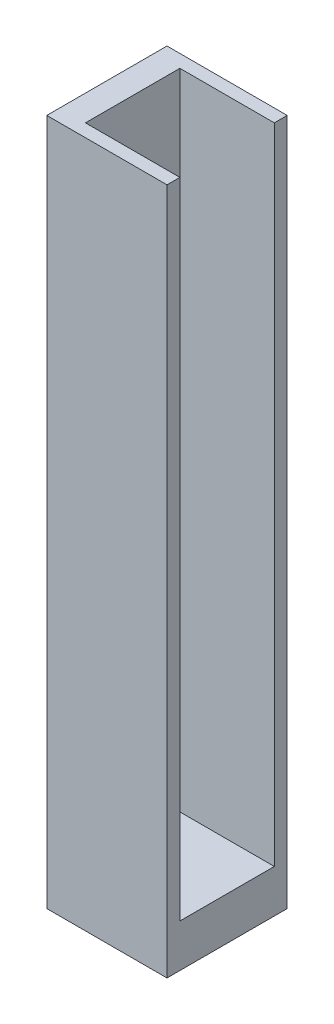
ISO-10303-21;
HEADER;
FILE_DESCRIPTION(('STEP AP214'),'2;1');
FILE_NAME('part.step','',(''),(''),'','','');
FILE_SCHEMA(('AUTOMOTIVE_DESIGN { 1 0 10303 214 1 1 1 1 }'));
ENDSEC;
DATA;
#1=APPLICATION_CONTEXT('core data for automotive mechanical design processes');
#2=APPLICATION_PROTOCOL_DEFINITION('international standard','automotive_design',2000,#1);
#3=PRODUCT_CONTEXT('',#1,'mechanical');
#4=PRODUCT('Part','Part','',(#3));
#5=PRODUCT_RELATED_PRODUCT_CATEGORY('part','',(#4));
#6=PRODUCT_DEFINITION_FORMATION('','',#4);
#7=PRODUCT_DEFINITION_CONTEXT('part definition',#1,'design');
#8=PRODUCT_DEFINITION('design','',#6,#7);
#9=PRODUCT_DEFINITION_SHAPE('','',#8);
#10=(LENGTH_UNIT() NAMED_UNIT(*) SI_UNIT(.MILLI.,.METRE.));
#11=(NAMED_UNIT(*) PLANE_ANGLE_UNIT() SI_UNIT($,.RADIAN.));
#12=(NAMED_UNIT(*) SI_UNIT($,.STERADIAN.) SOLID_ANGLE_UNIT());
#13=UNCERTAINTY_MEASURE_WITH_UNIT(LENGTH_MEASURE(1.E-05),#10,'distance_accuracy_value','');
#14=(GEOMETRIC_REPRESENTATION_CONTEXT(3) GLOBAL_UNCERTAINTY_ASSIGNED_CONTEXT((#13)) GLOBAL_UNIT_ASSIGNED_CONTEXT((#10,
#11,#12)) REPRESENTATION_CONTEXT('',''));
#15=CARTESIAN_POINT('',(0.,0.,0.));
#16=DIRECTION('',(0.,0.,1.));
#17=DIRECTION('',(1.,0.,0.));
#18=AXIS2_PLACEMENT_3D('',#15,#16,#17);
#19=CARTESIAN_POINT('',(-54.7529691211401,80.,-42.1270783847981));
#20=DIRECTION('',(1.,0.,0.));
#21=DIRECTION('',(0.,0.,-1.));
#22=AXIS2_PLACEMENT_3D('',#19,#20,#21);
#23=PLANE('',#22);
#24=DIRECTION('',(0.,0.,1.));
#25=VECTOR('',#24,1.);
#26=CARTESIAN_POINT('',(-54.7529691211401,0.,-42.1270783847981));
#27=LINE('',#26,#25);
#28=CARTESIAN_POINT('',(-54.7529691211401,0.,-56.1270783847981));
#29=VERTEX_POINT('',#28);
#30=CARTESIAN_POINT('',(-54.7529691211401,0.,-42.1270783847981));
#31=VERTEX_POINT('',#30);
#32=EDGE_CURVE('E142',#29,#31,#27,.T.);
#33=ORIENTED_EDGE('',*,*,#32,.T.);
#34=DIRECTION('',(0.,-1.,0.));
#35=VECTOR('',#34,1.);
#36=CARTESIAN_POINT('',(-54.7529691211401,80.,-42.1270783847981));
#37=LINE('',#36,#35);
#38=CARTESIAN_POINT('',(-54.7529691211401,80.,-42.1270783847981));
#39=VERTEX_POINT('',#38);
#40=EDGE_CURVE('E11',#39,#31,#37,.T.);
#41=ORIENTED_EDGE('',*,*,#40,.F.);
#42=DIRECTION('',(0.,0.,1.));
#43=VECTOR('',#42,1.);
#44=CARTESIAN_POINT('',(-54.7529691211401,80.,-42.1270783847981));
#45=LINE('',#44,#43);
#46=CARTESIAN_POINT('',(-54.7529691211401,80.,-56.1270783847981));
#47=VERTEX_POINT('',#46);
#48=EDGE_CURVE('E134',#47,#39,#45,.T.);
#49=ORIENTED_EDGE('',*,*,#48,.F.);
#50=DIRECTION('',(0.,-1.,0.));
#51=VECTOR('',#50,1.);
#52=CARTESIAN_POINT('',(-54.7529691211401,80.,-56.1270783847981));
#53=LINE('',#52,#51);
#54=EDGE_CURVE('E141',#47,#29,#53,.T.);
#55=ORIENTED_EDGE('',*,*,#54,.T.);
#56=EDGE_LOOP('',(#33,#41,#49,#55));
#57=FACE_BOUND('',#56,.T.);
#58=ADVANCED_FACE('F33',(#57),#23,.F.);
#59=CARTESIAN_POINT('',(-54.7529691211401,80.,-42.1270783847981));
#60=DIRECTION('',(0.,0.,-1.));
#61=DIRECTION('',(-1.,0.,0.));
#62=AXIS2_PLACEMENT_3D('',#59,#60,#61);
#63=PLANE('',#62);
#64=DIRECTION('',(1.,0.,0.));
#65=VECTOR('',#64,1.);
#66=CARTESIAN_POINT('',(-54.7529691211401,0.,-42.1270783847981));
#67=LINE('',#66,#65);
#68=CARTESIAN_POINT('',(-40.7529691211401,0.,-42.1270783847981));
#69=VERTEX_POINT('',#68);
#70=EDGE_CURVE('E145',#31,#69,#67,.T.);
#71=ORIENTED_EDGE('',*,*,#70,.T.);
#72=DIRECTION('',(0.,-1.,0.));
#73=VECTOR('',#72,1.);
#74=CARTESIAN_POINT('',(-40.7529691211401,80.,-42.1270783847981));
#75=LINE('',#74,#73);
#76=CARTESIAN_POINT('',(-40.7529691211401,80.,-42.1270783847981));
#77=VERTEX_POINT('',#76);
#78=EDGE_CURVE('E40',#77,#69,#75,.T.);
#79=ORIENTED_EDGE('',*,*,#78,.F.);
#80=DIRECTION('',(1.,0.,0.));
#81=VECTOR('',#80,1.);
#82=CARTESIAN_POINT('',(-54.7529691211401,80.,-42.1270783847981));
#83=LINE('',#82,#81);
#84=EDGE_CURVE('E84',#39,#77,#83,.T.);
#85=ORIENTED_EDGE('',*,*,#84,.F.);
#86=ORIENTED_EDGE('',*,*,#40,.T.);
#87=EDGE_LOOP('',(#71,#79,#85,#86));
#88=FACE_BOUND('',#87,.T.);
#89=ADVANCED_FACE('F171',(#88),#63,.F.);
#90=CARTESIAN_POINT('',(-40.7529691211401,80.,-42.1270783847981));
#91=DIRECTION('',(-1.,0.,0.));
#92=DIRECTION('',(0.,0.,1.));
#93=AXIS2_PLACEMENT_3D('',#90,#91,#92);
#94=PLANE('',#93);
#95=DIRECTION('',(0.,0.,-1.));
#96=VECTOR('',#95,1.);
#97=CARTESIAN_POINT('',(-40.7529691211401,5.,-43.6270783847981));
#98=LINE('',#97,#96);
#99=CARTESIAN_POINT('',(-40.7529691211401,5.,-43.6270783847981));
#100=VERTEX_POINT('',#99);
#101=CARTESIAN_POINT('',(-40.7529691211401,5.,-54.6270783847981));
#102=VERTEX_POINT('',#101);
#103=EDGE_CURVE('E113',#100,#102,#98,.T.);
#104=ORIENTED_EDGE('',*,*,#103,.F.);
#105=DIRECTION('',(0.,1.,0.));
#106=VECTOR('',#105,1.);
#107=CARTESIAN_POINT('',(-40.7529691211401,5.,-43.6270783847981));
#108=LINE('',#107,#106);
#109=CARTESIAN_POINT('',(-40.7529691211401,80.,-43.6270783847981));
#110=VERTEX_POINT('',#109);
#111=EDGE_CURVE('E146',#100,#110,#108,.T.);
#112=ORIENTED_EDGE('',*,*,#111,.T.);
#113=DIRECTION('',(0.,0.,-1.));
#114=VECTOR('',#113,1.);
#115=CARTESIAN_POINT('',(-40.7529691211401,80.,-42.1270783847981));
#116=LINE('',#115,#114);
#117=EDGE_CURVE('E137',#77,#110,#116,.T.);
#118=ORIENTED_EDGE('',*,*,#117,.F.);
#119=ORIENTED_EDGE('',*,*,#78,.T.);
#120=DIRECTION('',(0.,0.,-1.));
#121=VECTOR('',#120,1.);
#122=CARTESIAN_POINT('',(-40.7529691211401,0.,-42.1270783847981));
#123=LINE('',#122,#121);
#124=CARTESIAN_POINT('',(-40.7529691211401,0.,-56.1270783847981));
#125=VERTEX_POINT('',#124);
#126=EDGE_CURVE('E148',#69,#125,#123,.T.);
#127=ORIENTED_EDGE('',*,*,#126,.T.);
#128=DIRECTION('',(0.,-1.,0.));
#129=VECTOR('',#128,1.);
#130=CARTESIAN_POINT('',(-40.7529691211401,80.,-56.1270783847981));
#131=LINE('',#130,#129);
#132=CARTESIAN_POINT('',(-40.7529691211401,80.,-56.1270783847981));
#133=VERTEX_POINT('',#132);
#134=EDGE_CURVE('E152',#133,#125,#131,.T.);
#135=ORIENTED_EDGE('',*,*,#134,.F.);
#136=CARTESIAN_POINT('',(-40.7529691211401,80.,-54.6270783847981));
#137=VERTEX_POINT('',#136);
#138=EDGE_CURVE('E127',#137,#133,#116,.T.);
#139=ORIENTED_EDGE('',*,*,#138,.F.);
#140=DIRECTION('',(0.,1.,0.));
#141=VECTOR('',#140,1.);
#142=CARTESIAN_POINT('',(-40.7529691211401,5.,-54.6270783847981));
#143=LINE('',#142,#141);
#144=EDGE_CURVE('E47',#102,#137,#143,.T.);
#145=ORIENTED_EDGE('',*,*,#144,.F.);
#146=EDGE_LOOP('',(#104,#112,#118,#119,#127,#135,#139,#145));
#147=FACE_BOUND('',#146,.T.);
#148=ADVANCED_FACE('F125',(#147),#94,.F.);
#149=CARTESIAN_POINT('',(-54.7529691211401,80.,-56.1270783847981));
#150=DIRECTION('',(0.,0.,1.));
#151=DIRECTION('',(1.,0.,0.));
#152=AXIS2_PLACEMENT_3D('',#149,#150,#151);
#153=PLANE('',#152);
#154=DIRECTION('',(-1.,0.,0.));
#155=VECTOR('',#154,1.);
#156=CARTESIAN_POINT('',(-54.7529691211401,0.,-56.1270783847981));
#157=LINE('',#156,#155);
#158=EDGE_CURVE('E77',#125,#29,#157,.T.);
#159=ORIENTED_EDGE('',*,*,#158,.T.);
#160=ORIENTED_EDGE('',*,*,#54,.F.);
#161=DIRECTION('',(-1.,0.,0.));
#162=VECTOR('',#161,1.);
#163=CARTESIAN_POINT('',(-54.7529691211401,80.,-56.1270783847981));
#164=LINE('',#163,#162);
#165=EDGE_CURVE('E56',#133,#47,#164,.T.);
#166=ORIENTED_EDGE('',*,*,#165,.F.);
#167=ORIENTED_EDGE('',*,*,#134,.T.);
#168=EDGE_LOOP('',(#159,#160,#166,#167));
#169=FACE_BOUND('',#168,.T.);
#170=ADVANCED_FACE('F162',(#169),#153,.F.);
#171=CARTESIAN_POINT('',(0.,80.,0.));
#172=DIRECTION('',(0.,-1.,0.));
#173=DIRECTION('',(0.,0.,-1.));
#174=AXIS2_PLACEMENT_3D('',#171,#172,#173);
#175=PLANE('',#174);
#176=ORIENTED_EDGE('',*,*,#117,.T.);
#177=DIRECTION('',(1.,0.,0.));
#178=VECTOR('',#177,1.);
#179=CARTESIAN_POINT('',(-51.7529691211401,80.,-43.6270783847981));
#180=LINE('',#179,#178);
#181=CARTESIAN_POINT('',(-51.7529691211401,80.,-43.6270783847981));
#182=VERTEX_POINT('',#181);
#183=EDGE_CURVE('E122',#182,#110,#180,.T.);
#184=ORIENTED_EDGE('',*,*,#183,.F.);
#185=DIRECTION('',(0.,0.,1.));
#186=VECTOR('',#185,1.);
#187=CARTESIAN_POINT('',(-51.7529691211401,80.,-43.6270783847981));
#188=LINE('',#187,#186);
#189=CARTESIAN_POINT('',(-51.7529691211401,80.,-54.6270783847981));
#190=VERTEX_POINT('',#189);
#191=EDGE_CURVE('E238',#190,#182,#188,.T.);
#192=ORIENTED_EDGE('',*,*,#191,.F.);
#193=DIRECTION('',(-1.,0.,0.));
#194=VECTOR('',#193,1.);
#195=CARTESIAN_POINT('',(-51.7529691211401,80.,-54.6270783847981));
#196=LINE('',#195,#194);
#197=EDGE_CURVE('E240',#137,#190,#196,.T.);
#198=ORIENTED_EDGE('',*,*,#197,.F.);
#199=ORIENTED_EDGE('',*,*,#138,.T.);
#200=ORIENTED_EDGE('',*,*,#165,.T.);
#201=ORIENTED_EDGE('',*,*,#48,.T.);
#202=ORIENTED_EDGE('',*,*,#84,.T.);
#203=EDGE_LOOP('',(#176,#184,#192,#198,#199,#200,#201,#202));
#204=FACE_BOUND('',#203,.T.);
#205=ADVANCED_FACE('F164',(#204),#175,.F.);
#206=CARTESIAN_POINT('',(0.,0.,0.));
#207=DIRECTION('',(0.,-1.,0.));
#208=DIRECTION('',(0.,0.,-1.));
#209=AXIS2_PLACEMENT_3D('',#206,#207,#208);
#210=PLANE('',#209);
#211=ORIENTED_EDGE('',*,*,#32,.F.);
#212=ORIENTED_EDGE('',*,*,#158,.F.);
#213=ORIENTED_EDGE('',*,*,#126,.F.);
#214=ORIENTED_EDGE('',*,*,#70,.F.);
#215=EDGE_LOOP('',(#211,#212,#213,#214));
#216=FACE_BOUND('',#215,.T.);
#217=ADVANCED_FACE('F158',(#216),#210,.T.);
#218=CARTESIAN_POINT('',(-51.7529691211401,5.,-43.6270783847981));
#219=DIRECTION('',(0.,0.,1.));
#220=DIRECTION('',(1.,0.,0.));
#221=AXIS2_PLACEMENT_3D('',#218,#219,#220);
#222=PLANE('',#221);
#223=ORIENTED_EDGE('',*,*,#183,.T.);
#224=ORIENTED_EDGE('',*,*,#111,.F.);
#225=DIRECTION('',(1.,0.,0.));
#226=VECTOR('',#225,1.);
#227=CARTESIAN_POINT('',(-51.7529691211401,5.,-43.6270783847981));
#228=LINE('',#227,#226);
#229=CARTESIAN_POINT('',(-51.7529691211401,5.,-43.6270783847981));
#230=VERTEX_POINT('',#229);
#231=EDGE_CURVE('E119',#230,#100,#228,.T.);
#232=ORIENTED_EDGE('',*,*,#231,.F.);
#233=DIRECTION('',(0.,1.,0.));
#234=VECTOR('',#233,1.);
#235=CARTESIAN_POINT('',(-51.7529691211401,5.,-43.6270783847981));
#236=LINE('',#235,#234);
#237=EDGE_CURVE('E129',#230,#182,#236,.T.);
#238=ORIENTED_EDGE('',*,*,#237,.T.);
#239=EDGE_LOOP('',(#223,#224,#232,#238));
#240=FACE_BOUND('',#239,.T.);
#241=ADVANCED_FACE('F200',(#240),#222,.F.);
#242=CARTESIAN_POINT('',(-51.7529691211401,5.,-43.6270783847981));
#243=DIRECTION('',(-1.,0.,0.));
#244=DIRECTION('',(0.,0.,1.));
#245=AXIS2_PLACEMENT_3D('',#242,#243,#244);
#246=PLANE('',#245);
#247=ORIENTED_EDGE('',*,*,#191,.T.);
#248=ORIENTED_EDGE('',*,*,#237,.F.);
#249=DIRECTION('',(0.,0.,1.));
#250=VECTOR('',#249,1.);
#251=CARTESIAN_POINT('',(-51.7529691211401,5.,-43.6270783847981));
#252=LINE('',#251,#250);
#253=CARTESIAN_POINT('',(-51.7529691211401,5.,-54.6270783847981));
#254=VERTEX_POINT('',#253);
#255=EDGE_CURVE('E112',#254,#230,#252,.T.);
#256=ORIENTED_EDGE('',*,*,#255,.F.);
#257=DIRECTION('',(0.,1.,0.));
#258=VECTOR('',#257,1.);
#259=CARTESIAN_POINT('',(-51.7529691211401,5.,-54.6270783847981));
#260=LINE('',#259,#258);
#261=EDGE_CURVE('E108',#254,#190,#260,.T.);
#262=ORIENTED_EDGE('',*,*,#261,.T.);
#263=EDGE_LOOP('',(#247,#248,#256,#262));
#264=FACE_BOUND('',#263,.T.);
#265=ADVANCED_FACE('F205',(#264),#246,.F.);
#266=CARTESIAN_POINT('',(-51.7529691211401,5.,-54.6270783847981));
#267=DIRECTION('',(0.,0.,-1.));
#268=DIRECTION('',(-1.,0.,0.));
#269=AXIS2_PLACEMENT_3D('',#266,#267,#268);
#270=PLANE('',#269);
#271=ORIENTED_EDGE('',*,*,#197,.T.);
#272=ORIENTED_EDGE('',*,*,#261,.F.);
#273=DIRECTION('',(-1.,0.,0.));
#274=VECTOR('',#273,1.);
#275=CARTESIAN_POINT('',(-51.7529691211401,5.,-54.6270783847981));
#276=LINE('',#275,#274);
#277=EDGE_CURVE('E105',#102,#254,#276,.T.);
#278=ORIENTED_EDGE('',*,*,#277,.F.);
#279=ORIENTED_EDGE('',*,*,#144,.T.);
#280=EDGE_LOOP('',(#271,#272,#278,#279));
#281=FACE_BOUND('',#280,.T.);
#282=ADVANCED_FACE('F107',(#281),#270,.F.);
#283=CARTESIAN_POINT('',(0.,5.,0.));
#284=DIRECTION('',(0.,-1.,0.));
#285=DIRECTION('',(0.,0.,-1.));
#286=AXIS2_PLACEMENT_3D('',#283,#284,#285);
#287=PLANE('',#286);
#288=ORIENTED_EDGE('',*,*,#103,.T.);
#289=ORIENTED_EDGE('',*,*,#277,.T.);
#290=ORIENTED_EDGE('',*,*,#255,.T.);
#291=ORIENTED_EDGE('',*,*,#231,.T.);
#292=EDGE_LOOP('',(#288,#289,#290,#291));
#293=FACE_BOUND('',#292,.T.);
#294=ADVANCED_FACE('F117',(#293),#287,.F.);
#295=CLOSED_SHELL('',(#58,#89,#148,#170,#205,#217,#241,#265,#282,#294));
#296=MANIFOLD_SOLID_BREP('B2',#295);
#297=ADVANCED_BREP_SHAPE_REPRESENTATION('',(#18,#296),#14);
#298=SHAPE_DEFINITION_REPRESENTATION(#9,#297);
ENDSEC;
END-ISO-10303-21;
